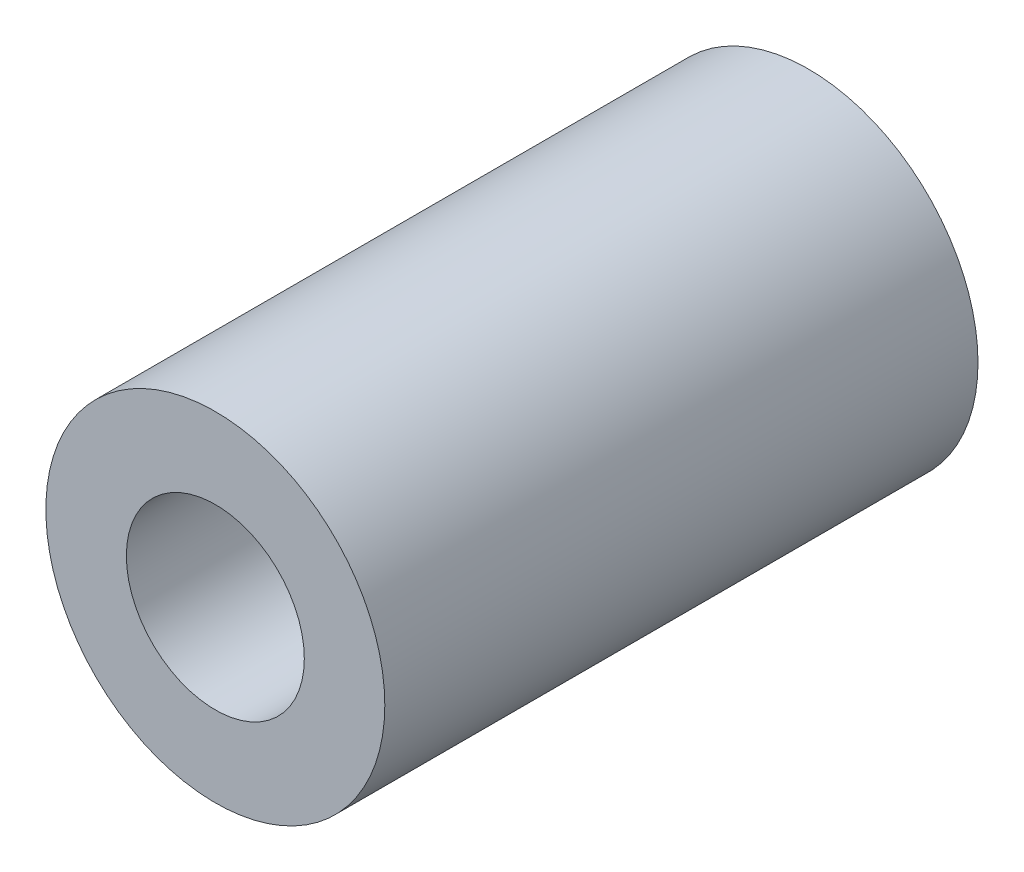
ISO-10303-21;
HEADER;
FILE_DESCRIPTION(('STEP AP214'),'2;1');
FILE_NAME('part.step','',(''),(''),'','','');
FILE_SCHEMA(('AUTOMOTIVE_DESIGN { 1 0 10303 214 1 1 1 1 }'));
ENDSEC;
DATA;
#1=APPLICATION_CONTEXT('core data for automotive mechanical design processes');
#2=APPLICATION_PROTOCOL_DEFINITION('international standard','automotive_design',2000,#1);
#3=PRODUCT_CONTEXT('',#1,'mechanical');
#4=PRODUCT('Part','Part','',(#3));
#5=PRODUCT_RELATED_PRODUCT_CATEGORY('part','',(#4));
#6=PRODUCT_DEFINITION_FORMATION('','',#4);
#7=PRODUCT_DEFINITION_CONTEXT('part definition',#1,'design');
#8=PRODUCT_DEFINITION('design','',#6,#7);
#9=PRODUCT_DEFINITION_SHAPE('','',#8);
#10=(LENGTH_UNIT() NAMED_UNIT(*) SI_UNIT(.MILLI.,.METRE.));
#11=(NAMED_UNIT(*) PLANE_ANGLE_UNIT() SI_UNIT($,.RADIAN.));
#12=(NAMED_UNIT(*) SI_UNIT($,.STERADIAN.) SOLID_ANGLE_UNIT());
#13=UNCERTAINTY_MEASURE_WITH_UNIT(LENGTH_MEASURE(1.E-05),#10,'distance_accuracy_value','');
#14=(GEOMETRIC_REPRESENTATION_CONTEXT(3) GLOBAL_UNCERTAINTY_ASSIGNED_CONTEXT((#13)) GLOBAL_UNIT_ASSIGNED_CONTEXT((#10,
#11,#12)) REPRESENTATION_CONTEXT('',''));
#15=CARTESIAN_POINT('',(0.,0.,0.));
#16=DIRECTION('',(0.,0.,1.));
#17=DIRECTION('',(1.,0.,0.));
#18=AXIS2_PLACEMENT_3D('',#15,#16,#17);
#19=CARTESIAN_POINT('',(0.,0.,7.));
#20=DIRECTION('',(0.,0.,1.));
#21=DIRECTION('',(1.,0.,0.));
#22=AXIS2_PLACEMENT_3D('',#19,#20,#21);
#23=PLANE('',#22);
#24=CARTESIAN_POINT('',(0.,0.,7.));
#25=DIRECTION('',(0.,0.,1.));
#26=DIRECTION('',(1.,0.,0.));
#27=AXIS2_PLACEMENT_3D('',#24,#25,#26);
#28=CIRCLE('',#27,4.);
#29=CARTESIAN_POINT('',(4.,0.,7.));
#30=VERTEX_POINT('',#29);
#31=EDGE_CURVE('E10',#30,#30,#28,.T.);
#32=ORIENTED_EDGE('',*,*,#31,.T.);
#33=EDGE_LOOP('',(#32));
#34=FACE_BOUND('',#33,.T.);
#35=CARTESIAN_POINT('',(0.,0.,7.));
#36=DIRECTION('',(0.,0.,1.));
#37=DIRECTION('',(1.,0.,0.));
#38=AXIS2_PLACEMENT_3D('',#35,#36,#37);
#39=CIRCLE('',#38,2.1);
#40=CARTESIAN_POINT('',(2.1,0.,7.));
#41=VERTEX_POINT('',#40);
#42=EDGE_CURVE('E41',#41,#41,#39,.T.);
#43=ORIENTED_EDGE('',*,*,#42,.F.);
#44=EDGE_LOOP('',(#43));
#45=FACE_BOUND('',#44,.T.);
#46=ADVANCED_FACE('F30',(#34,#45),#23,.T.);
#47=CARTESIAN_POINT('',(0.,0.,-7.));
#48=DIRECTION('',(0.,0.,1.));
#49=DIRECTION('',(1.,0.,0.));
#50=AXIS2_PLACEMENT_3D('',#47,#48,#49);
#51=PLANE('',#50);
#52=CARTESIAN_POINT('',(0.,0.,-7.));
#53=DIRECTION('',(0.,0.,1.));
#54=DIRECTION('',(1.,0.,0.));
#55=AXIS2_PLACEMENT_3D('',#52,#53,#54);
#56=CIRCLE('',#55,4.);
#57=CARTESIAN_POINT('',(4.,0.,-7.));
#58=VERTEX_POINT('',#57);
#59=EDGE_CURVE('E34',#58,#58,#56,.T.);
#60=ORIENTED_EDGE('',*,*,#59,.F.);
#61=EDGE_LOOP('',(#60));
#62=FACE_BOUND('',#61,.T.);
#63=CARTESIAN_POINT('',(0.,0.,-7.));
#64=DIRECTION('',(0.,0.,1.));
#65=DIRECTION('',(1.,0.,0.));
#66=AXIS2_PLACEMENT_3D('',#63,#64,#65);
#67=CIRCLE('',#66,2.1);
#68=CARTESIAN_POINT('',(2.1,0.,-7.));
#69=VERTEX_POINT('',#68);
#70=EDGE_CURVE('E43',#69,#69,#67,.T.);
#71=ORIENTED_EDGE('',*,*,#70,.T.);
#72=EDGE_LOOP('',(#71));
#73=FACE_BOUND('',#72,.T.);
#74=ADVANCED_FACE('F53',(#62,#73),#51,.F.);
#75=CARTESIAN_POINT('',(0.,0.,7.));
#76=DIRECTION('',(0.,0.,-1.));
#77=DIRECTION('',(-1.,0.,0.));
#78=AXIS2_PLACEMENT_3D('',#75,#76,#77);
#79=CYLINDRICAL_SURFACE('',#78,4.);
#80=ORIENTED_EDGE('',*,*,#31,.F.);
#81=EDGE_LOOP('',(#80));
#82=FACE_BOUND('',#81,.T.);
#83=ORIENTED_EDGE('',*,*,#59,.T.);
#84=EDGE_LOOP('',(#83));
#85=FACE_BOUND('',#84,.T.);
#86=ADVANCED_FACE('F32',(#82,#85),#79,.T.);
#87=CARTESIAN_POINT('',(0.,0.,7.));
#88=DIRECTION('',(0.,0.,-1.));
#89=DIRECTION('',(-1.,0.,0.));
#90=AXIS2_PLACEMENT_3D('',#87,#88,#89);
#91=CYLINDRICAL_SURFACE('',#90,2.1);
#92=ORIENTED_EDGE('',*,*,#42,.T.);
#93=EDGE_LOOP('',(#92));
#94=FACE_BOUND('',#93,.T.);
#95=ORIENTED_EDGE('',*,*,#70,.F.);
#96=EDGE_LOOP('',(#95));
#97=FACE_BOUND('',#96,.T.);
#98=ADVANCED_FACE('F49',(#94,#97),#91,.F.);
#99=CLOSED_SHELL('',(#46,#74,#86,#98));
#100=MANIFOLD_SOLID_BREP('B2',#99);
#101=ADVANCED_BREP_SHAPE_REPRESENTATION('',(#18,#100),#14);
#102=SHAPE_DEFINITION_REPRESENTATION(#9,#101);
ENDSEC;
END-ISO-10303-21;
